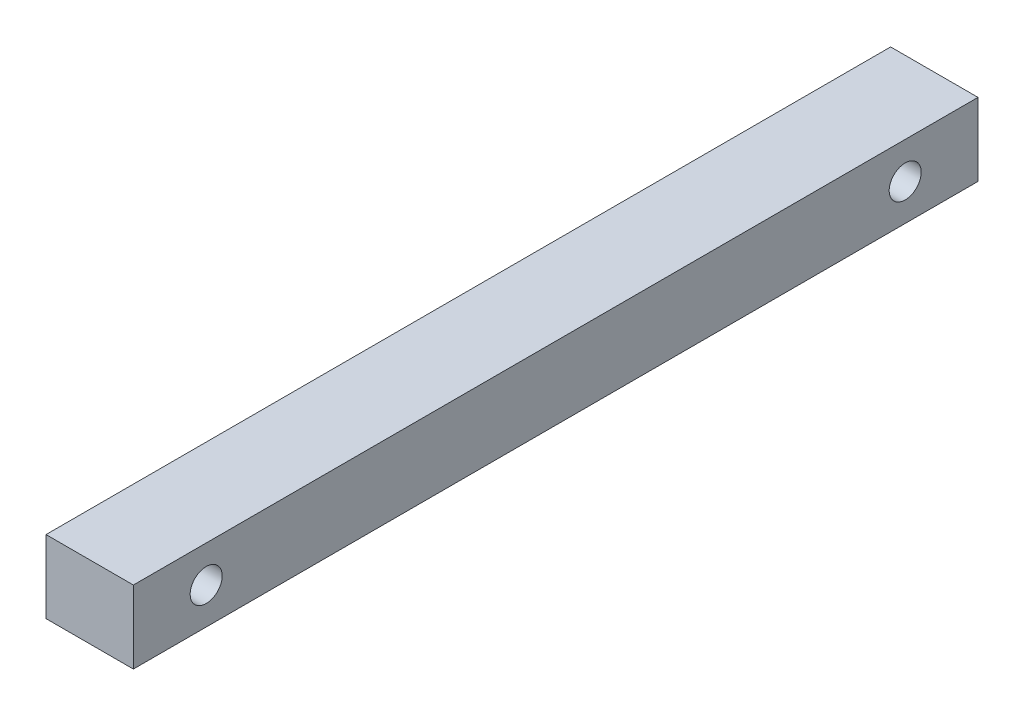
ISO-10303-21;
HEADER;
FILE_DESCRIPTION(('STEP AP214'),'2;1');
FILE_NAME('part.step','',(''),(''),'','','');
FILE_SCHEMA(('AUTOMOTIVE_DESIGN { 1 0 10303 214 1 1 1 1 }'));
ENDSEC;
DATA;
#1=APPLICATION_CONTEXT('core data for automotive mechanical design processes');
#2=APPLICATION_PROTOCOL_DEFINITION('international standard','automotive_design',2000,#1);
#3=PRODUCT_CONTEXT('',#1,'mechanical');
#4=PRODUCT('Part','Part','',(#3));
#5=PRODUCT_RELATED_PRODUCT_CATEGORY('part','',(#4));
#6=PRODUCT_DEFINITION_FORMATION('','',#4);
#7=PRODUCT_DEFINITION_CONTEXT('part definition',#1,'design');
#8=PRODUCT_DEFINITION('design','',#6,#7);
#9=PRODUCT_DEFINITION_SHAPE('','',#8);
#10=(LENGTH_UNIT() NAMED_UNIT(*) SI_UNIT(.MILLI.,.METRE.));
#11=(NAMED_UNIT(*) PLANE_ANGLE_UNIT() SI_UNIT($,.RADIAN.));
#12=(NAMED_UNIT(*) SI_UNIT($,.STERADIAN.) SOLID_ANGLE_UNIT());
#13=UNCERTAINTY_MEASURE_WITH_UNIT(LENGTH_MEASURE(1.E-05),#10,'distance_accuracy_value','');
#14=(GEOMETRIC_REPRESENTATION_CONTEXT(3) GLOBAL_UNCERTAINTY_ASSIGNED_CONTEXT((#13)) GLOBAL_UNIT_ASSIGNED_CONTEXT((#10,
#11,#12)) REPRESENTATION_CONTEXT('',''));
#15=CARTESIAN_POINT('',(0.,0.,0.));
#16=DIRECTION('',(0.,0.,1.));
#17=DIRECTION('',(1.,0.,0.));
#18=AXIS2_PLACEMENT_3D('',#15,#16,#17);
#19=CARTESIAN_POINT('',(-15.,-12.5,290.));
#20=DIRECTION('',(1.,0.,0.));
#21=DIRECTION('',(0.,0.,-1.));
#22=AXIS2_PLACEMENT_3D('',#19,#20,#21);
#23=PLANE('',#22);
#24=CARTESIAN_POINT('',(-15.,0.,265.));
#25=DIRECTION('',(-1.,0.,0.));
#26=DIRECTION('',(0.,0.,1.));
#27=AXIS2_PLACEMENT_3D('',#24,#25,#26);
#28=CIRCLE('',#27,5.50000000000002);
#29=CARTESIAN_POINT('',(-15.,0.,270.5));
#30=VERTEX_POINT('',#29);
#31=EDGE_CURVE('E113',#30,#30,#28,.T.);
#32=ORIENTED_EDGE('',*,*,#31,.F.);
#33=EDGE_LOOP('',(#32));
#34=FACE_BOUND('',#33,.T.);
#35=CARTESIAN_POINT('',(-15.,0.,25.));
#36=DIRECTION('',(-1.,0.,0.));
#37=DIRECTION('',(0.,0.,1.));
#38=AXIS2_PLACEMENT_3D('',#35,#36,#37);
#39=CIRCLE('',#38,5.5);
#40=CARTESIAN_POINT('',(-15.,0.,30.5));
#41=VERTEX_POINT('',#40);
#42=EDGE_CURVE('E118',#41,#41,#39,.T.);
#43=ORIENTED_EDGE('',*,*,#42,.F.);
#44=EDGE_LOOP('',(#43));
#45=FACE_BOUND('',#44,.T.);
#46=DIRECTION('',(0.,-1.,0.));
#47=VECTOR('',#46,1.);
#48=CARTESIAN_POINT('',(-15.,-12.5,0.));
#49=LINE('',#48,#47);
#50=CARTESIAN_POINT('',(-15.,12.5,0.));
#51=VERTEX_POINT('',#50);
#52=CARTESIAN_POINT('',(-15.,-12.5,0.));
#53=VERTEX_POINT('',#52);
#54=EDGE_CURVE('E104',#51,#53,#49,.T.);
#55=ORIENTED_EDGE('',*,*,#54,.T.);
#56=DIRECTION('',(0.,0.,-1.));
#57=VECTOR('',#56,1.);
#58=CARTESIAN_POINT('',(-15.,-12.5,290.));
#59=LINE('',#58,#57);
#60=CARTESIAN_POINT('',(-15.,-12.5,290.));
#61=VERTEX_POINT('',#60);
#62=EDGE_CURVE('E11',#61,#53,#59,.T.);
#63=ORIENTED_EDGE('',*,*,#62,.F.);
#64=DIRECTION('',(0.,-1.,0.));
#65=VECTOR('',#64,1.);
#66=CARTESIAN_POINT('',(-15.,-12.5,290.));
#67=LINE('',#66,#65);
#68=CARTESIAN_POINT('',(-15.,12.5,290.));
#69=VERTEX_POINT('',#68);
#70=EDGE_CURVE('E91',#69,#61,#67,.T.);
#71=ORIENTED_EDGE('',*,*,#70,.F.);
#72=DIRECTION('',(0.,0.,-1.));
#73=VECTOR('',#72,1.);
#74=CARTESIAN_POINT('',(-15.,12.5,290.));
#75=LINE('',#74,#73);
#76=EDGE_CURVE('E100',#69,#51,#75,.T.);
#77=ORIENTED_EDGE('',*,*,#76,.T.);
#78=EDGE_LOOP('',(#55,#63,#71,#77));
#79=FACE_BOUND('',#78,.T.);
#80=ADVANCED_FACE('F38',(#34,#45,#79),#23,.F.);
#81=CARTESIAN_POINT('',(15.,-12.5,290.));
#82=DIRECTION('',(0.,1.,0.));
#83=DIRECTION('',(-1.,0.,0.));
#84=AXIS2_PLACEMENT_3D('',#81,#82,#83);
#85=PLANE('',#84);
#86=DIRECTION('',(1.,0.,0.));
#87=VECTOR('',#86,1.);
#88=CARTESIAN_POINT('',(15.,-12.5,0.));
#89=LINE('',#88,#87);
#90=CARTESIAN_POINT('',(15.,-12.5,0.));
#91=VERTEX_POINT('',#90);
#92=EDGE_CURVE('E95',#53,#91,#89,.T.);
#93=ORIENTED_EDGE('',*,*,#92,.T.);
#94=DIRECTION('',(0.,0.,-1.));
#95=VECTOR('',#94,1.);
#96=CARTESIAN_POINT('',(15.,-12.5,290.));
#97=LINE('',#96,#95);
#98=CARTESIAN_POINT('',(15.,-12.5,290.));
#99=VERTEX_POINT('',#98);
#100=EDGE_CURVE('E47',#99,#91,#97,.T.);
#101=ORIENTED_EDGE('',*,*,#100,.F.);
#102=DIRECTION('',(1.,0.,0.));
#103=VECTOR('',#102,1.);
#104=CARTESIAN_POINT('',(15.,-12.5,290.));
#105=LINE('',#104,#103);
#106=EDGE_CURVE('E86',#61,#99,#105,.T.);
#107=ORIENTED_EDGE('',*,*,#106,.F.);
#108=ORIENTED_EDGE('',*,*,#62,.T.);
#109=EDGE_LOOP('',(#93,#101,#107,#108));
#110=FACE_BOUND('',#109,.T.);
#111=ADVANCED_FACE('F94',(#110),#85,.F.);
#112=CARTESIAN_POINT('',(15.,-12.5,290.));
#113=DIRECTION('',(-1.,0.,0.));
#114=DIRECTION('',(0.,0.,1.));
#115=AXIS2_PLACEMENT_3D('',#112,#113,#114);
#116=PLANE('',#115);
#117=CARTESIAN_POINT('',(15.,0.,265.));
#118=DIRECTION('',(-1.,0.,0.));
#119=DIRECTION('',(0.,0.,1.));
#120=AXIS2_PLACEMENT_3D('',#117,#118,#119);
#121=CIRCLE('',#120,5.50000000000002);
#122=CARTESIAN_POINT('',(15.,0.,270.5));
#123=VERTEX_POINT('',#122);
#124=EDGE_CURVE('E41',#123,#123,#121,.T.);
#125=ORIENTED_EDGE('',*,*,#124,.T.);
#126=EDGE_LOOP('',(#125));
#127=FACE_BOUND('',#126,.T.);
#128=CARTESIAN_POINT('',(15.,0.,25.));
#129=DIRECTION('',(-1.,0.,0.));
#130=DIRECTION('',(0.,0.,1.));
#131=AXIS2_PLACEMENT_3D('',#128,#129,#130);
#132=CIRCLE('',#131,5.5);
#133=CARTESIAN_POINT('',(15.,0.,30.5));
#134=VERTEX_POINT('',#133);
#135=EDGE_CURVE('E111',#134,#134,#132,.T.);
#136=ORIENTED_EDGE('',*,*,#135,.T.);
#137=EDGE_LOOP('',(#136));
#138=FACE_BOUND('',#137,.T.);
#139=DIRECTION('',(0.,1.,0.));
#140=VECTOR('',#139,1.);
#141=CARTESIAN_POINT('',(15.,-12.5,0.));
#142=LINE('',#141,#140);
#143=CARTESIAN_POINT('',(15.,12.5,0.));
#144=VERTEX_POINT('',#143);
#145=EDGE_CURVE('E73',#91,#144,#142,.T.);
#146=ORIENTED_EDGE('',*,*,#145,.T.);
#147=DIRECTION('',(0.,0.,-1.));
#148=VECTOR('',#147,1.);
#149=CARTESIAN_POINT('',(15.,12.5,290.));
#150=LINE('',#149,#148);
#151=CARTESIAN_POINT('',(15.,12.5,290.));
#152=VERTEX_POINT('',#151);
#153=EDGE_CURVE('E96',#152,#144,#150,.T.);
#154=ORIENTED_EDGE('',*,*,#153,.F.);
#155=DIRECTION('',(0.,1.,0.));
#156=VECTOR('',#155,1.);
#157=CARTESIAN_POINT('',(15.,-12.5,290.));
#158=LINE('',#157,#156);
#159=EDGE_CURVE('E89',#99,#152,#158,.T.);
#160=ORIENTED_EDGE('',*,*,#159,.F.);
#161=ORIENTED_EDGE('',*,*,#100,.T.);
#162=EDGE_LOOP('',(#146,#154,#160,#161));
#163=FACE_BOUND('',#162,.T.);
#164=ADVANCED_FACE('F98',(#127,#138,#163),#116,.F.);
#165=CARTESIAN_POINT('',(15.,12.5,290.));
#166=DIRECTION('',(0.,-1.,0.));
#167=DIRECTION('',(1.,0.,0.));
#168=AXIS2_PLACEMENT_3D('',#165,#166,#167);
#169=PLANE('',#168);
#170=DIRECTION('',(-1.,0.,0.));
#171=VECTOR('',#170,1.);
#172=CARTESIAN_POINT('',(15.,12.5,0.));
#173=LINE('',#172,#171);
#174=EDGE_CURVE('E79',#144,#51,#173,.T.);
#175=ORIENTED_EDGE('',*,*,#174,.T.);
#176=ORIENTED_EDGE('',*,*,#76,.F.);
#177=DIRECTION('',(-1.,0.,0.));
#178=VECTOR('',#177,1.);
#179=CARTESIAN_POINT('',(15.,12.5,290.));
#180=LINE('',#179,#178);
#181=EDGE_CURVE('E56',#152,#69,#180,.T.);
#182=ORIENTED_EDGE('',*,*,#181,.F.);
#183=ORIENTED_EDGE('',*,*,#153,.T.);
#184=EDGE_LOOP('',(#175,#176,#182,#183));
#185=FACE_BOUND('',#184,.T.);
#186=ADVANCED_FACE('F143',(#185),#169,.F.);
#187=CARTESIAN_POINT('',(0.,0.,290.));
#188=DIRECTION('',(0.,0.,1.));
#189=DIRECTION('',(1.,0.,0.));
#190=AXIS2_PLACEMENT_3D('',#187,#188,#189);
#191=PLANE('',#190);
#192=ORIENTED_EDGE('',*,*,#70,.T.);
#193=ORIENTED_EDGE('',*,*,#106,.T.);
#194=ORIENTED_EDGE('',*,*,#159,.T.);
#195=ORIENTED_EDGE('',*,*,#181,.T.);
#196=EDGE_LOOP('',(#192,#193,#194,#195));
#197=FACE_BOUND('',#196,.T.);
#198=ADVANCED_FACE('F87',(#197),#191,.T.);
#199=CARTESIAN_POINT('',(0.,0.,0.));
#200=DIRECTION('',(0.,0.,1.));
#201=DIRECTION('',(1.,0.,0.));
#202=AXIS2_PLACEMENT_3D('',#199,#200,#201);
#203=PLANE('',#202);
#204=ORIENTED_EDGE('',*,*,#54,.F.);
#205=ORIENTED_EDGE('',*,*,#174,.F.);
#206=ORIENTED_EDGE('',*,*,#145,.F.);
#207=ORIENTED_EDGE('',*,*,#92,.F.);
#208=EDGE_LOOP('',(#204,#205,#206,#207));
#209=FACE_BOUND('',#208,.T.);
#210=ADVANCED_FACE('F134',(#209),#203,.F.);
#211=CARTESIAN_POINT('',(275.,0.,25.));
#212=DIRECTION('',(-1.,0.,0.));
#213=DIRECTION('',(0.,0.,1.));
#214=AXIS2_PLACEMENT_3D('',#211,#212,#213);
#215=CYLINDRICAL_SURFACE('',#214,5.5);
#216=ORIENTED_EDGE('',*,*,#42,.T.);
#217=EDGE_LOOP('',(#216));
#218=FACE_BOUND('',#217,.T.);
#219=ORIENTED_EDGE('',*,*,#135,.F.);
#220=EDGE_LOOP('',(#219));
#221=FACE_BOUND('',#220,.T.);
#222=ADVANCED_FACE('F126',(#218,#221),#215,.F.);
#223=CARTESIAN_POINT('',(275.,0.,265.));
#224=DIRECTION('',(-1.,0.,0.));
#225=DIRECTION('',(0.,0.,1.));
#226=AXIS2_PLACEMENT_3D('',#223,#224,#225);
#227=CYLINDRICAL_SURFACE('',#226,5.50000000000002);
#228=ORIENTED_EDGE('',*,*,#31,.T.);
#229=EDGE_LOOP('',(#228));
#230=FACE_BOUND('',#229,.T.);
#231=ORIENTED_EDGE('',*,*,#124,.F.);
#232=EDGE_LOOP('',(#231));
#233=FACE_BOUND('',#232,.T.);
#234=ADVANCED_FACE('F141',(#230,#233),#227,.F.);
#235=CLOSED_SHELL('',(#80,#111,#164,#186,#198,#210,#222,#234));
#236=MANIFOLD_SOLID_BREP('B2',#235);
#237=ADVANCED_BREP_SHAPE_REPRESENTATION('',(#18,#236),#14);
#238=SHAPE_DEFINITION_REPRESENTATION(#9,#237);
ENDSEC;
END-ISO-10303-21;
